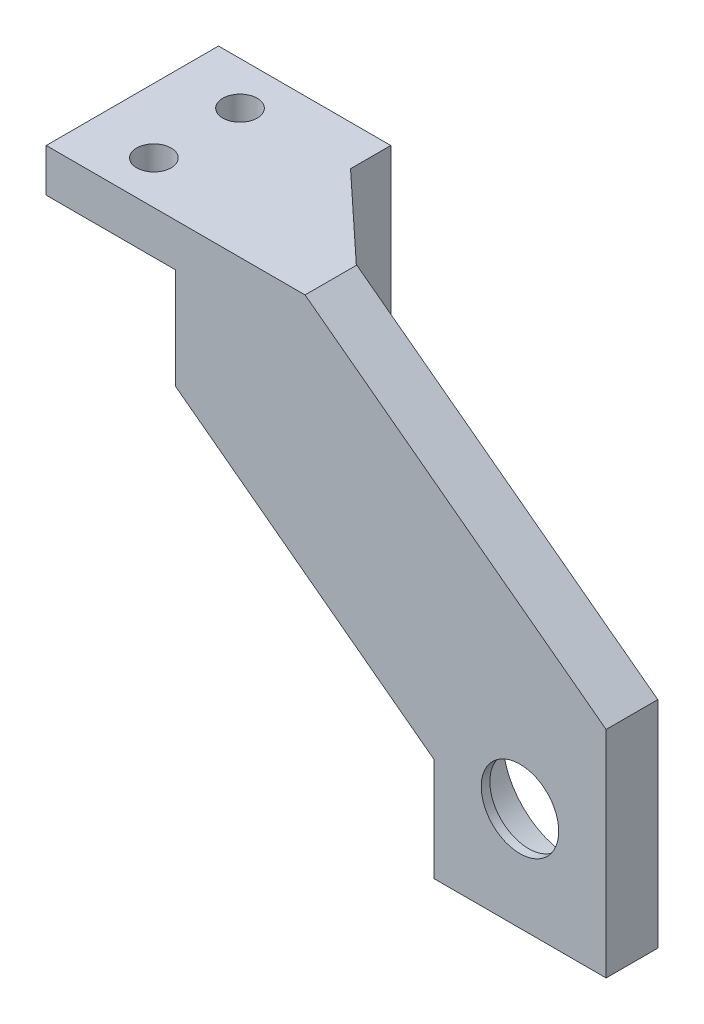
ISO-10303-21;
HEADER;
FILE_DESCRIPTION(('STEP AP214'),'2;1');
FILE_NAME('part.step','',(''),(''),'','','');
FILE_SCHEMA(('AUTOMOTIVE_DESIGN { 1 0 10303 214 1 1 1 1 }'));
ENDSEC;
DATA;
#1=APPLICATION_CONTEXT('core data for automotive mechanical design processes');
#2=APPLICATION_PROTOCOL_DEFINITION('international standard','automotive_design',2000,#1);
#3=PRODUCT_CONTEXT('',#1,'mechanical');
#4=PRODUCT('Part','Part','',(#3));
#5=PRODUCT_RELATED_PRODUCT_CATEGORY('part','',(#4));
#6=PRODUCT_DEFINITION_FORMATION('','',#4);
#7=PRODUCT_DEFINITION_CONTEXT('part definition',#1,'design');
#8=PRODUCT_DEFINITION('design','',#6,#7);
#9=PRODUCT_DEFINITION_SHAPE('','',#8);
#10=(LENGTH_UNIT() NAMED_UNIT(*) SI_UNIT(.MILLI.,.METRE.));
#11=(NAMED_UNIT(*) PLANE_ANGLE_UNIT() SI_UNIT($,.RADIAN.));
#12=(NAMED_UNIT(*) SI_UNIT($,.STERADIAN.) SOLID_ANGLE_UNIT());
#13=UNCERTAINTY_MEASURE_WITH_UNIT(LENGTH_MEASURE(1.E-05),#10,'distance_accuracy_value','');
#14=(GEOMETRIC_REPRESENTATION_CONTEXT(3) GLOBAL_UNCERTAINTY_ASSIGNED_CONTEXT((#13)) GLOBAL_UNIT_ASSIGNED_CONTEXT((#10,
#11,#12)) REPRESENTATION_CONTEXT('',''));
#15=CARTESIAN_POINT('',(0.,0.,0.));
#16=DIRECTION('',(0.,0.,1.));
#17=DIRECTION('',(1.,0.,0.));
#18=AXIS2_PLACEMENT_3D('',#15,#16,#17);
#19=CARTESIAN_POINT('',(0.,0.,-5.));
#20=DIRECTION('',(0.,0.,1.));
#21=DIRECTION('',(1.,0.,0.));
#22=AXIS2_PLACEMENT_3D('',#19,#20,#21);
#23=PLANE('',#22);
#24=CARTESIAN_POINT('',(0.,0.,-5.));
#25=DIRECTION('',(0.,0.,1.));
#26=DIRECTION('',(1.,0.,0.));
#27=AXIS2_PLACEMENT_3D('',#24,#25,#26);
#28=CIRCLE('',#27,8.);
#29=CARTESIAN_POINT('',(8.,0.,-5.00000000000001));
#30=VERTEX_POINT('',#29);
#31=EDGE_CURVE('E142',#30,#30,#28,.F.);
#32=ORIENTED_EDGE('',*,*,#31,.F.);
#33=EDGE_LOOP('',(#32));
#34=FACE_BOUND('',#33,.T.);
#35=DIRECTION('',(-1.,0.,0.));
#36=VECTOR('',#35,1.);
#37=CARTESIAN_POINT('',(0.,39.2000000000012,-5.));
#38=LINE('',#37,#36);
#39=CARTESIAN_POINT('',(-24.9487685866672,39.2000000000012,-5.));
#40=VERTEX_POINT('',#39);
#41=CARTESIAN_POINT('',(-25.0000000000002,39.2000000000012,-5.));
#42=VERTEX_POINT('',#41);
#43=EDGE_CURVE('E135',#40,#42,#38,.T.);
#44=ORIENTED_EDGE('',*,*,#43,.F.);
#45=DIRECTION('',(0.799999999999987,-0.600000000000018,0.));
#46=VECTOR('',#45,1.);
#47=CARTESIAN_POINT('',(9.83444330880013,13.1125910783996,-5.));
#48=LINE('',#47,#46);
#49=CARTESIAN_POINT('',(10.,12.9884235599996,-5.));
#50=VERTEX_POINT('',#49);
#51=EDGE_CURVE('E50',#40,#50,#48,.T.);
#52=ORIENTED_EDGE('',*,*,#51,.T.);
#53=DIRECTION('',(0.,-1.,0.));
#54=VECTOR('',#53,1.);
#55=CARTESIAN_POINT('',(10.,0.,-5.));
#56=LINE('',#55,#54);
#57=CARTESIAN_POINT('',(10.,-12.,-5.));
#58=VERTEX_POINT('',#57);
#59=EDGE_CURVE('E133',#50,#58,#56,.T.);
#60=ORIENTED_EDGE('',*,*,#59,.T.);
#61=DIRECTION('',(-1.,0.,0.));
#62=VECTOR('',#61,1.);
#63=CARTESIAN_POINT('',(0.,-12.,-5.));
#64=LINE('',#63,#62);
#65=CARTESIAN_POINT('',(-9.99999999999998,-12.,-5.));
#66=VERTEX_POINT('',#65);
#67=EDGE_CURVE('E258',#58,#66,#64,.T.);
#68=ORIENTED_EDGE('',*,*,#67,.T.);
#69=DIRECTION('',(0.,1.,0.));
#70=VECTOR('',#69,1.);
#71=CARTESIAN_POINT('',(-9.99999999999999,0.,-5.));
#72=LINE('',#71,#70);
#73=CARTESIAN_POINT('',(-10.,0.,-5.));
#74=VERTEX_POINT('',#73);
#75=EDGE_CURVE('E156',#66,#74,#72,.T.);
#76=ORIENTED_EDGE('',*,*,#75,.T.);
#77=DIRECTION('',(-0.799999999999987,0.600000000000018,0.));
#78=VECTOR('',#77,1.);
#79=CARTESIAN_POINT('',(-3.60000000000021,-4.80000000000006,-5.));
#80=LINE('',#79,#78);
#81=CARTESIAN_POINT('',(-25.0000000000002,11.2500000000007,-5.));
#82=VERTEX_POINT('',#81);
#83=EDGE_CURVE('E143',#74,#82,#80,.T.);
#84=ORIENTED_EDGE('',*,*,#83,.T.);
#85=DIRECTION('',(0.,-1.,0.));
#86=VECTOR('',#85,1.);
#87=CARTESIAN_POINT('',(-25.0000000000002,107.207352543679,-4.99999999999999));
#88=LINE('',#87,#86);
#89=EDGE_CURVE('E57',#42,#82,#88,.T.);
#90=ORIENTED_EDGE('',*,*,#89,.F.);
#91=EDGE_LOOP('',(#44,#52,#60,#68,#76,#84,#90));
#92=FACE_BOUND('',#91,.T.);
#93=ADVANCED_FACE('F35',(#34,#92),#23,.F.);
#94=CARTESIAN_POINT('',(0.,34.2000000000012,0.));
#95=DIRECTION('',(0.,1.,0.));
#96=DIRECTION('',(0.,0.,1.));
#97=AXIS2_PLACEMENT_3D('',#94,#95,#96);
#98=PLANE('',#97);
#99=CARTESIAN_POINT('',(-47.5000000000003,34.2000000000012,-14.));
#100=DIRECTION('',(0.,1.,0.));
#101=DIRECTION('',(0.,0.,1.));
#102=AXIS2_PLACEMENT_3D('',#99,#100,#101);
#103=CIRCLE('',#102,2.);
#104=CARTESIAN_POINT('',(-47.5000000000003,34.2000000000012,-12.));
#105=VERTEX_POINT('',#104);
#106=EDGE_CURVE('E281',#105,#105,#103,.T.);
#107=ORIENTED_EDGE('',*,*,#106,.T.);
#108=EDGE_LOOP('',(#107));
#109=FACE_BOUND('',#108,.T.);
#110=CARTESIAN_POINT('',(-47.5000000000003,34.2000000000012,-3.99999999999999));
#111=DIRECTION('',(0.,1.,0.));
#112=DIRECTION('',(0.,0.,1.));
#113=AXIS2_PLACEMENT_3D('',#110,#111,#112);
#114=CIRCLE('',#113,2.);
#115=CARTESIAN_POINT('',(-47.5000000000003,34.2000000000012,-1.99999999999999));
#116=VERTEX_POINT('',#115);
#117=EDGE_CURVE('E284',#116,#116,#114,.T.);
#118=ORIENTED_EDGE('',*,*,#117,.T.);
#119=EDGE_LOOP('',(#118));
#120=FACE_BOUND('',#119,.T.);
#121=DIRECTION('',(1.,0.,0.));
#122=VECTOR('',#121,1.);
#123=CARTESIAN_POINT('',(0.,34.2000000000012,-19.));
#124=LINE('',#123,#122);
#125=CARTESIAN_POINT('',(-55.0000000000003,34.2000000000012,-19.));
#126=VERTEX_POINT('',#125);
#127=CARTESIAN_POINT('',(-40.0000000000003,34.2000000000012,-19.));
#128=VERTEX_POINT('',#127);
#129=EDGE_CURVE('E236',#126,#128,#124,.T.);
#130=ORIENTED_EDGE('',*,*,#129,.T.);
#131=DIRECTION('',(0.,0.,1.));
#132=VECTOR('',#131,1.);
#133=CARTESIAN_POINT('',(-40.0000000000003,34.2000000000012,-65.5775535986731));
#134=LINE('',#133,#132);
#135=CARTESIAN_POINT('',(-40.0000000000003,34.2000000000012,1.00000000000001));
#136=VERTEX_POINT('',#135);
#137=EDGE_CURVE('E161',#128,#136,#134,.T.);
#138=ORIENTED_EDGE('',*,*,#137,.T.);
#139=DIRECTION('',(-1.,0.,0.));
#140=VECTOR('',#139,1.);
#141=CARTESIAN_POINT('',(0.,34.2000000000012,1.));
#142=LINE('',#141,#140);
#143=CARTESIAN_POINT('',(-55.0000000000003,34.2000000000012,1.));
#144=VERTEX_POINT('',#143);
#145=EDGE_CURVE('E242',#136,#144,#142,.T.);
#146=ORIENTED_EDGE('',*,*,#145,.T.);
#147=DIRECTION('',(0.,0.,-1.));
#148=VECTOR('',#147,1.);
#149=CARTESIAN_POINT('',(-55.0000000000003,34.2000000000012,0.));
#150=LINE('',#149,#148);
#151=EDGE_CURVE('E239',#144,#126,#150,.T.);
#152=ORIENTED_EDGE('',*,*,#151,.T.);
#153=EDGE_LOOP('',(#130,#138,#146,#152));
#154=FACE_BOUND('',#153,.T.);
#155=ADVANCED_FACE('F179',(#109,#120,#154),#98,.F.);
#156=CARTESIAN_POINT('',(0.,0.,0.));
#157=DIRECTION('',(0.,0.,1.));
#158=DIRECTION('',(1.,0.,0.));
#159=AXIS2_PLACEMENT_3D('',#156,#157,#158);
#160=PLANE('',#159);
#161=CARTESIAN_POINT('',(0.,0.,0.));
#162=DIRECTION('',(0.,0.,1.));
#163=DIRECTION('',(1.,0.,0.));
#164=AXIS2_PLACEMENT_3D('',#161,#162,#163);
#165=CIRCLE('',#164,4.5);
#166=CARTESIAN_POINT('',(4.5,0.,0.));
#167=VERTEX_POINT('',#166);
#168=EDGE_CURVE('E146',#167,#167,#165,.T.);
#169=ORIENTED_EDGE('',*,*,#168,.T.);
#170=EDGE_LOOP('',(#169));
#171=FACE_BOUND('',#170,.T.);
#172=CARTESIAN_POINT('',(0.,0.,0.));
#173=DIRECTION('',(0.,0.,1.));
#174=DIRECTION('',(1.,0.,0.));
#175=AXIS2_PLACEMENT_3D('',#172,#173,#174);
#176=CIRCLE('',#175,8.);
#177=CARTESIAN_POINT('',(8.,0.,0.));
#178=VERTEX_POINT('',#177);
#179=EDGE_CURVE('E43',#178,#178,#176,.T.);
#180=ORIENTED_EDGE('',*,*,#179,.F.);
#181=EDGE_LOOP('',(#180));
#182=FACE_BOUND('',#181,.T.);
#183=ADVANCED_FACE('F177',(#171,#182),#160,.F.);
#184=CARTESIAN_POINT('',(0.,0.,1.));
#185=DIRECTION('',(0.,0.,-1.));
#186=DIRECTION('',(-1.,0.,0.));
#187=AXIS2_PLACEMENT_3D('',#184,#185,#186);
#188=CYLINDRICAL_SURFACE('',#187,4.5);
#189=CARTESIAN_POINT('',(0.,0.,1.));
#190=DIRECTION('',(0.,0.,1.));
#191=DIRECTION('',(1.,0.,0.));
#192=AXIS2_PLACEMENT_3D('',#189,#190,#191);
#193=CIRCLE('',#192,4.5);
#194=CARTESIAN_POINT('',(4.5,0.,1.));
#195=VERTEX_POINT('',#194);
#196=EDGE_CURVE('E168',#195,#195,#193,.T.);
#197=ORIENTED_EDGE('',*,*,#196,.T.);
#198=EDGE_LOOP('',(#197));
#199=FACE_BOUND('',#198,.T.);
#200=ORIENTED_EDGE('',*,*,#168,.F.);
#201=EDGE_LOOP('',(#200));
#202=FACE_BOUND('',#201,.T.);
#203=ADVANCED_FACE('F37',(#199,#202),#188,.F.);
#204=CARTESIAN_POINT('',(0.,0.,1.));
#205=DIRECTION('',(0.,0.,1.));
#206=DIRECTION('',(1.,0.,0.));
#207=AXIS2_PLACEMENT_3D('',#204,#205,#206);
#208=PLANE('',#207);
#209=DIRECTION('',(0.799999999999987,-0.600000000000018,0.));
#210=VECTOR('',#209,1.);
#211=CARTESIAN_POINT('',(9.83444330880013,13.1125910783996,1.));
#212=LINE('',#211,#210);
#213=CARTESIAN_POINT('',(-24.9487685866672,39.2000000000012,1.));
#214=VERTEX_POINT('',#213);
#215=CARTESIAN_POINT('',(10.,12.9884235599996,1.00000000000001));
#216=VERTEX_POINT('',#215);
#217=EDGE_CURVE('E126',#214,#216,#212,.T.);
#218=ORIENTED_EDGE('',*,*,#217,.F.);
#219=DIRECTION('',(1.,0.,0.));
#220=VECTOR('',#219,1.);
#221=CARTESIAN_POINT('',(0.,39.2000000000012,1.));
#222=LINE('',#221,#220);
#223=CARTESIAN_POINT('',(-55.0000000000003,39.2000000000012,1.00000000000001));
#224=VERTEX_POINT('',#223);
#225=EDGE_CURVE('E213',#224,#214,#222,.T.);
#226=ORIENTED_EDGE('',*,*,#225,.F.);
#227=DIRECTION('',(0.,-1.,0.));
#228=VECTOR('',#227,1.);
#229=CARTESIAN_POINT('',(-55.0000000000003,107.207352543679,1.00000000000001));
#230=LINE('',#229,#228);
#231=EDGE_CURVE('E245',#224,#144,#230,.T.);
#232=ORIENTED_EDGE('',*,*,#231,.T.);
#233=ORIENTED_EDGE('',*,*,#145,.F.);
#234=DIRECTION('',(0.,-1.,0.));
#235=VECTOR('',#234,1.);
#236=CARTESIAN_POINT('',(-40.0000000000002,0.,1.));
#237=LINE('',#236,#235);
#238=CARTESIAN_POINT('',(-40.0000000000002,22.5000000000012,1.));
#239=VERTEX_POINT('',#238);
#240=EDGE_CURVE('E152',#136,#239,#237,.T.);
#241=ORIENTED_EDGE('',*,*,#240,.T.);
#242=DIRECTION('',(0.799999999999987,-0.600000000000018,0.));
#243=VECTOR('',#242,1.);
#244=CARTESIAN_POINT('',(-3.60000000000021,-4.80000000000006,1.));
#245=LINE('',#244,#243);
#246=CARTESIAN_POINT('',(-9.99999999999999,0.,1.));
#247=VERTEX_POINT('',#246);
#248=EDGE_CURVE('E155',#239,#247,#245,.T.);
#249=ORIENTED_EDGE('',*,*,#248,.T.);
#250=DIRECTION('',(0.,-1.,0.));
#251=VECTOR('',#250,1.);
#252=CARTESIAN_POINT('',(-9.99999999999999,0.,1.));
#253=LINE('',#252,#251);
#254=CARTESIAN_POINT('',(-9.99999999999998,-12.,1.));
#255=VERTEX_POINT('',#254);
#256=EDGE_CURVE('E255',#247,#255,#253,.T.);
#257=ORIENTED_EDGE('',*,*,#256,.T.);
#258=DIRECTION('',(1.,0.,0.));
#259=VECTOR('',#258,1.);
#260=CARTESIAN_POINT('',(0.,-12.,1.));
#261=LINE('',#260,#259);
#262=CARTESIAN_POINT('',(10.,-12.,1.));
#263=VERTEX_POINT('',#262);
#264=EDGE_CURVE('E254',#255,#263,#261,.T.);
#265=ORIENTED_EDGE('',*,*,#264,.T.);
#266=DIRECTION('',(0.,1.,0.));
#267=VECTOR('',#266,1.);
#268=CARTESIAN_POINT('',(10.,0.,1.));
#269=LINE('',#268,#267);
#270=EDGE_CURVE('E159',#263,#216,#269,.T.);
#271=ORIENTED_EDGE('',*,*,#270,.T.);
#272=EDGE_LOOP('',(#218,#226,#232,#233,#241,#249,#257,#265,#271));
#273=FACE_BOUND('',#272,.T.);
#274=ORIENTED_EDGE('',*,*,#196,.F.);
#275=EDGE_LOOP('',(#274));
#276=FACE_BOUND('',#275,.T.);
#277=ADVANCED_FACE('F185',(#273,#276),#208,.T.);
#278=CARTESIAN_POINT('',(0.,0.,-33.2842712474619));
#279=DIRECTION('',(0.,0.,1.));
#280=DIRECTION('',(1.,0.,0.));
#281=AXIS2_PLACEMENT_3D('',#278,#279,#280);
#282=CYLINDRICAL_SURFACE('',#281,8.);
#283=CARTESIAN_POINT('',(8.,0.,-5.00000000000001));
#284=CARTESIAN_POINT('',(8.,0.,-4.94791666666667));
#285=CARTESIAN_POINT('',(8.,0.,-4.89583333333334));
#286=CARTESIAN_POINT('',(8.,0.,-4.79166666666667));
#287=CARTESIAN_POINT('',(8.,0.,-4.73958333333334));
#288=CARTESIAN_POINT('',(8.,0.,-4.63541666666667));
#289=CARTESIAN_POINT('',(8.,0.,-4.58333333333334));
#290=CARTESIAN_POINT('',(8.,0.,-4.47916666666667));
#291=CARTESIAN_POINT('',(8.,0.,-4.42708333333334));
#292=CARTESIAN_POINT('',(8.,0.,-4.32291666666667));
#293=CARTESIAN_POINT('',(8.,0.,-4.27083333333334));
#294=CARTESIAN_POINT('',(8.,0.,-4.16666666666667));
#295=CARTESIAN_POINT('',(8.,0.,-4.11458333333334));
#296=CARTESIAN_POINT('',(8.,0.,-4.01041666666667));
#297=CARTESIAN_POINT('',(8.,0.,-3.95833333333334));
#298=CARTESIAN_POINT('',(8.,0.,-3.85416666666667));
#299=CARTESIAN_POINT('',(8.,0.,-3.80208333333334));
#300=CARTESIAN_POINT('',(8.,0.,-3.69791666666667));
#301=CARTESIAN_POINT('',(8.,0.,-3.64583333333334));
#302=CARTESIAN_POINT('',(8.,0.,-3.54166666666667));
#303=CARTESIAN_POINT('',(8.,0.,-3.48958333333334));
#304=CARTESIAN_POINT('',(8.,0.,-3.38541666666667));
#305=CARTESIAN_POINT('',(8.,0.,-3.33333333333334));
#306=CARTESIAN_POINT('',(8.,0.,-3.22916666666667));
#307=CARTESIAN_POINT('',(8.,0.,-3.17708333333334));
#308=CARTESIAN_POINT('',(8.,0.,-3.07291666666667));
#309=CARTESIAN_POINT('',(8.,0.,-3.02083333333334));
#310=CARTESIAN_POINT('',(8.,0.,-2.91666666666667));
#311=CARTESIAN_POINT('',(8.,0.,-2.86458333333334));
#312=CARTESIAN_POINT('',(8.,0.,-2.76041666666667));
#313=CARTESIAN_POINT('',(8.,0.,-2.70833333333334));
#314=CARTESIAN_POINT('',(8.,0.,-2.60416666666667));
#315=CARTESIAN_POINT('',(8.,0.,-2.55208333333334));
#316=CARTESIAN_POINT('',(8.,0.,-2.44791666666667));
#317=CARTESIAN_POINT('',(8.,0.,-2.39583333333334));
#318=CARTESIAN_POINT('',(8.,0.,-2.29166666666667));
#319=CARTESIAN_POINT('',(8.,0.,-2.23958333333334));
#320=CARTESIAN_POINT('',(8.,0.,-2.13541666666667));
#321=CARTESIAN_POINT('',(8.,0.,-2.08333333333334));
#322=CARTESIAN_POINT('',(8.,0.,-1.97916666666667));
#323=CARTESIAN_POINT('',(8.,0.,-1.92708333333334));
#324=CARTESIAN_POINT('',(8.,0.,-1.82291666666668));
#325=CARTESIAN_POINT('',(8.,0.,-1.77083333333334));
#326=CARTESIAN_POINT('',(8.,0.,-1.66666666666668));
#327=CARTESIAN_POINT('',(8.,0.,-1.61458333333334));
#328=CARTESIAN_POINT('',(8.,0.,-1.51041666666667));
#329=CARTESIAN_POINT('',(8.,0.,-1.45833333333334));
#330=CARTESIAN_POINT('',(8.,0.,-1.35416666666667));
#331=CARTESIAN_POINT('',(8.,0.,-1.30208333333334));
#332=CARTESIAN_POINT('',(8.,0.,-1.19791666666668));
#333=CARTESIAN_POINT('',(8.,0.,-1.14583333333334));
#334=CARTESIAN_POINT('',(8.,0.,-1.04166666666668));
#335=CARTESIAN_POINT('',(8.,0.,-0.989583333333342));
#336=CARTESIAN_POINT('',(8.,0.,-0.885416666666673));
#337=CARTESIAN_POINT('',(8.,0.,-0.833333333333339));
#338=CARTESIAN_POINT('',(8.,0.,-0.729166666666672));
#339=CARTESIAN_POINT('',(8.,0.,-0.67708333333334));
#340=CARTESIAN_POINT('',(8.,0.,-0.572916666666675));
#341=CARTESIAN_POINT('',(8.,0.,-0.520833333333343));
#342=CARTESIAN_POINT('',(8.,0.,-0.416666666666676));
#343=CARTESIAN_POINT('',(8.,0.,-0.364583333333342));
#344=CARTESIAN_POINT('',(8.,0.,-0.260416666666673));
#345=CARTESIAN_POINT('',(8.,0.,-0.208333333333338));
#346=CARTESIAN_POINT('',(8.,0.,-0.104166666666671));
#347=CARTESIAN_POINT('',(8.,0.,-0.0520833333333391));
#348=CARTESIAN_POINT('',(8.,0.,0.));
#349=B_SPLINE_CURVE_WITH_KNOTS('',3,(#283,#284,#285,#286,#287,#288,#289,#290,#291,#292,#293,
#294,#295,#296,#297,#298,#299,#300,#301,#302,#303,#304,#305,#306,#307,#308,#309,#310,#311,#312,
#313,#314,#315,#316,#317,#318,#319,#320,#321,#322,#323,#324,#325,#326,#327,#328,#329,#330,#331,
#332,#333,#334,#335,#336,#337,#338,#339,#340,#341,#342,#343,#344,#345,#346,#347,#348),
.UNSPECIFIED.,.F.,.F.,(4,2,2,2,2,2,2,2,2,2,2,2,2,2,2,2,2,2,2,2,2,2,2,2,2,2,2,2,2,2,2,2,4),(0.,
0.15625,0.3125,0.46875,0.625000000000001,0.781250000000001,0.937500000000001,1.09375,1.25,
1.40625,1.5625,1.71875,1.875,2.03125,2.1875,2.34375,2.5,2.65625,2.8125,2.96875,3.125,3.28125,
3.4375,3.59375,3.75,3.90625,4.0625,4.21875,4.375,4.53125,4.6875,4.84375,5.),.UNSPECIFIED.);
#350=EDGE_CURVE('BSEAM175',#30,#178,#349,.T.);
#351=ORIENTED_EDGE('',*,*,#31,.T.);
#352=ORIENTED_EDGE('',*,*,#179,.T.);
#353=ORIENTED_EDGE('',*,*,#350,.T.);
#354=ORIENTED_EDGE('',*,*,#350,.F.);
#355=EDGE_LOOP('',(#351,#353,#352,#354));
#356=FACE_BOUND('',#355,.T.);
#357=ADVANCED_FACE('F175',(#356),#282,.F.);
#358=CARTESIAN_POINT('',(10.,0.,-65.5775535986731));
#359=DIRECTION('',(1.,0.,0.));
#360=DIRECTION('',(0.,1.,0.));
#361=AXIS2_PLACEMENT_3D('',#358,#359,#360);
#362=PLANE('',#361);
#363=DIRECTION('',(0.,0.,1.));
#364=VECTOR('',#363,1.);
#365=CARTESIAN_POINT('',(10.,12.9884235599996,-19.));
#366=LINE('',#365,#364);
#367=EDGE_CURVE('E123',#50,#216,#366,.T.);
#368=ORIENTED_EDGE('',*,*,#367,.T.);
#369=ORIENTED_EDGE('',*,*,#270,.F.);
#370=DIRECTION('',(0.,0.,1.));
#371=VECTOR('',#370,1.);
#372=CARTESIAN_POINT('',(10.,-12.,-65.5775535986731));
#373=LINE('',#372,#371);
#374=EDGE_CURVE('E141',#58,#263,#373,.T.);
#375=ORIENTED_EDGE('',*,*,#374,.F.);
#376=ORIENTED_EDGE('',*,*,#59,.F.);
#377=EDGE_LOOP('',(#368,#369,#375,#376));
#378=FACE_BOUND('',#377,.T.);
#379=ADVANCED_FACE('F139',(#378),#362,.T.);
#380=CARTESIAN_POINT('',(-3.60000000000021,-4.80000000000006,-65.5775535986731));
#381=DIRECTION('',(-0.600000000000018,-0.799999999999987,0.));
#382=DIRECTION('',(0.799999999999987,-0.600000000000018,0.));
#383=AXIS2_PLACEMENT_3D('',#380,#381,#382);
#384=PLANE('',#383);
#385=ORIENTED_EDGE('',*,*,#83,.F.);
#386=DIRECTION('',(0.,0.,1.));
#387=VECTOR('',#386,1.);
#388=CARTESIAN_POINT('',(-9.99999999999999,0.,-65.5775535986731));
#389=LINE('',#388,#387);
#390=EDGE_CURVE('E148',#74,#247,#389,.T.);
#391=ORIENTED_EDGE('',*,*,#390,.T.);
#392=ORIENTED_EDGE('',*,*,#248,.F.);
#393=DIRECTION('',(0.,0.,1.));
#394=VECTOR('',#393,1.);
#395=CARTESIAN_POINT('',(-40.0000000000002,22.5000000000012,-65.5775535986731));
#396=LINE('',#395,#394);
#397=CARTESIAN_POINT('',(-40.0000000000003,22.5000000000012,-19.));
#398=VERTEX_POINT('',#397);
#399=EDGE_CURVE('E164',#398,#239,#396,.T.);
#400=ORIENTED_EDGE('',*,*,#399,.F.);
#401=DIRECTION('',(0.799999999999987,-0.600000000000018,0.));
#402=VECTOR('',#401,1.);
#403=CARTESIAN_POINT('',(-0.620126354511602,-7.03490523411663,-19.));
#404=LINE('',#403,#402);
#405=CARTESIAN_POINT('',(-35.0000000000003,18.7500000000011,-19.));
#406=VERTEX_POINT('',#405);
#407=EDGE_CURVE('E277',#398,#406,#404,.T.);
#408=ORIENTED_EDGE('',*,*,#407,.T.);
#409=DIRECTION('',(0.,0.,1.));
#410=VECTOR('',#409,1.);
#411=CARTESIAN_POINT('',(-35.0000000000003,18.7500000000011,0.));
#412=LINE('',#411,#410);
#413=CARTESIAN_POINT('',(-35.0000000000003,18.7500000000011,-14.33));
#414=VERTEX_POINT('',#413);
#415=EDGE_CURVE('E274',#406,#414,#412,.T.);
#416=ORIENTED_EDGE('',*,*,#415,.T.);
#417=DIRECTION('',(0.641106126814885,-0.480829595111186,0.598152016318285));
#418=VECTOR('',#417,1.);
#419=CARTESIAN_POINT('',(-7.4255051826885,-1.93087111298372,11.3970036645518));
#420=LINE('',#419,#418);
#421=EDGE_CURVE('E271',#414,#82,#420,.T.);
#422=ORIENTED_EDGE('',*,*,#421,.T.);
#423=EDGE_LOOP('',(#385,#391,#392,#400,#408,#416,#422));
#424=FACE_BOUND('',#423,.T.);
#425=ADVANCED_FACE('F269',(#424),#384,.T.);
#426=CARTESIAN_POINT('',(-40.0000000000002,0.,-65.5775535986731));
#427=DIRECTION('',(-1.,0.,0.));
#428=DIRECTION('',(0.,-1.,0.));
#429=AXIS2_PLACEMENT_3D('',#426,#427,#428);
#430=PLANE('',#429);
#431=ORIENTED_EDGE('',*,*,#137,.F.);
#432=DIRECTION('',(0.,1.,0.));
#433=VECTOR('',#432,1.);
#434=CARTESIAN_POINT('',(-40.0000000000003,-6.20807009476784,-19.));
#435=LINE('',#434,#433);
#436=EDGE_CURVE('E228',#398,#128,#435,.T.);
#437=ORIENTED_EDGE('',*,*,#436,.F.);
#438=ORIENTED_EDGE('',*,*,#399,.T.);
#439=ORIENTED_EDGE('',*,*,#240,.F.);
#440=EDGE_LOOP('',(#431,#437,#438,#439));
#441=FACE_BOUND('',#440,.T.);
#442=ADVANCED_FACE('F319',(#441),#430,.T.);
#443=CARTESIAN_POINT('',(0.,-12.,-65.5775535986731));
#444=DIRECTION('',(0.,-1.,0.));
#445=DIRECTION('',(0.,0.,-1.));
#446=AXIS2_PLACEMENT_3D('',#443,#444,#445);
#447=PLANE('',#446);
#448=ORIENTED_EDGE('',*,*,#67,.F.);
#449=ORIENTED_EDGE('',*,*,#374,.T.);
#450=ORIENTED_EDGE('',*,*,#264,.F.);
#451=DIRECTION('',(0.,0.,1.));
#452=VECTOR('',#451,1.);
#453=CARTESIAN_POINT('',(-9.99999999999998,-12.,-65.5775535986731));
#454=LINE('',#453,#452);
#455=EDGE_CURVE('E252',#66,#255,#454,.T.);
#456=ORIENTED_EDGE('',*,*,#455,.F.);
#457=EDGE_LOOP('',(#448,#449,#450,#456));
#458=FACE_BOUND('',#457,.T.);
#459=ADVANCED_FACE('F333',(#458),#447,.T.);
#460=CARTESIAN_POINT('',(-9.99999999999999,0.,-65.5775535986731));
#461=DIRECTION('',(-1.,0.,0.));
#462=DIRECTION('',(0.,-1.,0.));
#463=AXIS2_PLACEMENT_3D('',#460,#461,#462);
#464=PLANE('',#463);
#465=ORIENTED_EDGE('',*,*,#75,.F.);
#466=ORIENTED_EDGE('',*,*,#455,.T.);
#467=ORIENTED_EDGE('',*,*,#256,.F.);
#468=ORIENTED_EDGE('',*,*,#390,.F.);
#469=EDGE_LOOP('',(#465,#466,#467,#468));
#470=FACE_BOUND('',#469,.T.);
#471=ADVANCED_FACE('F266',(#470),#464,.T.);
#472=CARTESIAN_POINT('',(-9.14051085037126,107.207352543679,9.79690337660378));
#473=DIRECTION('',(0.682187982374244,0.,-0.731176829983116));
#474=DIRECTION('',(-0.731176829983116,0.,-0.682187982374244));
#475=AXIS2_PLACEMENT_3D('',#472,#473,#474);
#476=PLANE('',#475);
#477=DIRECTION('',(-0.731176829983116,0.,-0.682187982374244));
#478=VECTOR('',#477,1.);
#479=CARTESIAN_POINT('',(-9.14051085037126,39.2000000000012,9.79690337660378));
#480=LINE('',#479,#478);
#481=CARTESIAN_POINT('',(-35.0000000000003,39.2000000000012,-14.33));
#482=VERTEX_POINT('',#481);
#483=EDGE_CURVE('E234',#42,#482,#480,.T.);
#484=ORIENTED_EDGE('',*,*,#483,.F.);
#485=ORIENTED_EDGE('',*,*,#89,.T.);
#486=ORIENTED_EDGE('',*,*,#421,.F.);
#487=DIRECTION('',(0.,-1.,0.));
#488=VECTOR('',#487,1.);
#489=CARTESIAN_POINT('',(-35.0000000000003,107.207352543679,-14.33));
#490=LINE('',#489,#488);
#491=EDGE_CURVE('E221',#482,#414,#490,.T.);
#492=ORIENTED_EDGE('',*,*,#491,.F.);
#493=EDGE_LOOP('',(#484,#485,#486,#492));
#494=FACE_BOUND('',#493,.T.);
#495=ADVANCED_FACE('F325',(#494),#476,.T.);
#496=CARTESIAN_POINT('',(-35.0000000000003,107.207352543679,0.));
#497=DIRECTION('',(1.,0.,0.));
#498=DIRECTION('',(0.,1.,0.));
#499=AXIS2_PLACEMENT_3D('',#496,#497,#498);
#500=PLANE('',#499);
#501=DIRECTION('',(0.,0.,-1.));
#502=VECTOR('',#501,1.);
#503=CARTESIAN_POINT('',(-35.0000000000003,39.2000000000012,0.));
#504=LINE('',#503,#502);
#505=CARTESIAN_POINT('',(-35.0000000000003,39.2000000000012,-19.));
#506=VERTEX_POINT('',#505);
#507=EDGE_CURVE('E232',#482,#506,#504,.T.);
#508=ORIENTED_EDGE('',*,*,#507,.F.);
#509=ORIENTED_EDGE('',*,*,#491,.T.);
#510=ORIENTED_EDGE('',*,*,#415,.F.);
#511=DIRECTION('',(0.,-1.,0.));
#512=VECTOR('',#511,1.);
#513=CARTESIAN_POINT('',(-35.0000000000003,107.207352543679,-19.));
#514=LINE('',#513,#512);
#515=EDGE_CURVE('E225',#506,#406,#514,.T.);
#516=ORIENTED_EDGE('',*,*,#515,.F.);
#517=EDGE_LOOP('',(#508,#509,#510,#516));
#518=FACE_BOUND('',#517,.T.);
#519=ADVANCED_FACE('F324',(#518),#500,.T.);
#520=CARTESIAN_POINT('',(0.,107.207352543679,-19.));
#521=DIRECTION('',(0.,0.,-1.));
#522=DIRECTION('',(-1.,0.,0.));
#523=AXIS2_PLACEMENT_3D('',#520,#521,#522);
#524=PLANE('',#523);
#525=DIRECTION('',(-1.,0.,0.));
#526=VECTOR('',#525,1.);
#527=CARTESIAN_POINT('',(0.,39.2000000000012,-19.));
#528=LINE('',#527,#526);
#529=CARTESIAN_POINT('',(-55.0000000000003,39.2000000000012,-19.));
#530=VERTEX_POINT('',#529);
#531=EDGE_CURVE('E223',#506,#530,#528,.T.);
#532=ORIENTED_EDGE('',*,*,#531,.F.);
#533=ORIENTED_EDGE('',*,*,#515,.T.);
#534=ORIENTED_EDGE('',*,*,#407,.F.);
#535=ORIENTED_EDGE('',*,*,#436,.T.);
#536=ORIENTED_EDGE('',*,*,#129,.F.);
#537=DIRECTION('',(0.,-1.,0.));
#538=VECTOR('',#537,1.);
#539=CARTESIAN_POINT('',(-55.0000000000003,107.207352543679,-19.));
#540=LINE('',#539,#538);
#541=EDGE_CURVE('E247',#530,#126,#540,.T.);
#542=ORIENTED_EDGE('',*,*,#541,.F.);
#543=EDGE_LOOP('',(#532,#533,#534,#535,#536,#542));
#544=FACE_BOUND('',#543,.T.);
#545=ADVANCED_FACE('F317',(#544),#524,.T.);
#546=CARTESIAN_POINT('',(-55.0000000000003,107.207352543679,0.));
#547=DIRECTION('',(-1.,0.,0.));
#548=DIRECTION('',(0.,-1.,0.));
#549=AXIS2_PLACEMENT_3D('',#546,#547,#548);
#550=PLANE('',#549);
#551=DIRECTION('',(0.,0.,1.));
#552=VECTOR('',#551,1.);
#553=CARTESIAN_POINT('',(-55.0000000000003,39.2000000000012,0.));
#554=LINE('',#553,#552);
#555=EDGE_CURVE('E220',#530,#224,#554,.T.);
#556=ORIENTED_EDGE('',*,*,#555,.F.);
#557=ORIENTED_EDGE('',*,*,#541,.T.);
#558=ORIENTED_EDGE('',*,*,#151,.F.);
#559=ORIENTED_EDGE('',*,*,#231,.F.);
#560=EDGE_LOOP('',(#556,#557,#558,#559));
#561=FACE_BOUND('',#560,.T.);
#562=ADVANCED_FACE('F299',(#561),#550,.T.);
#563=CARTESIAN_POINT('',(0.,39.2000000000012,-174.094532476243));
#564=DIRECTION('',(0.,-1.,0.));
#565=DIRECTION('',(0.,0.,1.));
#566=AXIS2_PLACEMENT_3D('',#563,#564,#565);
#567=PLANE('',#566);
#568=CARTESIAN_POINT('',(-47.5000000000003,39.2000000000012,-14.));
#569=DIRECTION('',(0.,1.,0.));
#570=DIRECTION('',(0.,0.,1.));
#571=AXIS2_PLACEMENT_3D('',#568,#569,#570);
#572=CIRCLE('',#571,2.);
#573=CARTESIAN_POINT('',(-47.5000000000003,39.2000000000012,-12.));
#574=VERTEX_POINT('',#573);
#575=EDGE_CURVE('E287',#574,#574,#572,.T.);
#576=ORIENTED_EDGE('',*,*,#575,.F.);
#577=EDGE_LOOP('',(#576));
#578=FACE_BOUND('',#577,.T.);
#579=CARTESIAN_POINT('',(-47.5000000000003,39.2000000000012,-3.99999999999999));
#580=DIRECTION('',(0.,1.,0.));
#581=DIRECTION('',(0.,0.,-1.));
#582=AXIS2_PLACEMENT_3D('',#579,#580,#581);
#583=CIRCLE('',#582,2.);
#584=CARTESIAN_POINT('',(-47.5000000000003,39.2000000000012,-5.99999999999999));
#585=VERTEX_POINT('',#584);
#586=EDGE_CURVE('E136',#585,#585,#583,.T.);
#587=ORIENTED_EDGE('',*,*,#586,.F.);
#588=EDGE_LOOP('',(#587));
#589=FACE_BOUND('',#588,.T.);
#590=ORIENTED_EDGE('',*,*,#225,.T.);
#591=DIRECTION('',(0.,0.,-1.));
#592=VECTOR('',#591,1.);
#593=CARTESIAN_POINT('',(-24.9487685866672,39.2000000000012,-174.094532476243));
#594=LINE('',#593,#592);
#595=EDGE_CURVE('E11',#214,#40,#594,.T.);
#596=ORIENTED_EDGE('',*,*,#595,.T.);
#597=ORIENTED_EDGE('',*,*,#43,.T.);
#598=ORIENTED_EDGE('',*,*,#483,.T.);
#599=ORIENTED_EDGE('',*,*,#507,.T.);
#600=ORIENTED_EDGE('',*,*,#531,.T.);
#601=ORIENTED_EDGE('',*,*,#555,.T.);
#602=EDGE_LOOP('',(#590,#596,#597,#598,#599,#600,#601));
#603=FACE_BOUND('',#602,.T.);
#604=ADVANCED_FACE('F218',(#578,#589,#603),#567,.F.);
#605=CARTESIAN_POINT('',(-47.5000000000003,-12.,-3.99999999999999));
#606=DIRECTION('',(0.,1.,0.));
#607=DIRECTION('',(0.,0.,1.));
#608=AXIS2_PLACEMENT_3D('',#605,#606,#607);
#609=CYLINDRICAL_SURFACE('',#608,2.);
#610=ORIENTED_EDGE('',*,*,#586,.T.);
#611=EDGE_LOOP('',(#610));
#612=FACE_BOUND('',#611,.T.);
#613=ORIENTED_EDGE('',*,*,#117,.F.);
#614=EDGE_LOOP('',(#613));
#615=FACE_BOUND('',#614,.T.);
#616=ADVANCED_FACE('F298',(#612,#615),#609,.F.);
#617=CARTESIAN_POINT('',(-47.5000000000003,-12.,-14.));
#618=DIRECTION('',(0.,1.,0.));
#619=DIRECTION('',(0.,0.,1.));
#620=AXIS2_PLACEMENT_3D('',#617,#618,#619);
#621=CYLINDRICAL_SURFACE('',#620,2.);
#622=ORIENTED_EDGE('',*,*,#575,.T.);
#623=EDGE_LOOP('',(#622));
#624=FACE_BOUND('',#623,.T.);
#625=ORIENTED_EDGE('',*,*,#106,.F.);
#626=EDGE_LOOP('',(#625));
#627=FACE_BOUND('',#626,.T.);
#628=ADVANCED_FACE('F293',(#624,#627),#621,.F.);
#629=CARTESIAN_POINT('',(0.,20.48842356,-19.));
#630=DIRECTION('',(-0.600000000000018,-0.799999999999987,0.));
#631=DIRECTION('',(0.799999999999987,-0.600000000000018,0.));
#632=AXIS2_PLACEMENT_3D('',#629,#630,#631);
#633=PLANE('',#632);
#634=ORIENTED_EDGE('',*,*,#595,.F.);
#635=ORIENTED_EDGE('',*,*,#217,.T.);
#636=ORIENTED_EDGE('',*,*,#367,.F.);
#637=ORIENTED_EDGE('',*,*,#51,.F.);
#638=EDGE_LOOP('',(#634,#635,#636,#637));
#639=FACE_BOUND('',#638,.T.);
#640=ADVANCED_FACE('F124',(#639),#633,.F.);
#641=CLOSED_SHELL('',(#93,#155,#183,#203,#277,#357,#379,#425,#442,#459,#471,#495,#519,#545,#562,
#604,#616,#628,#640));
#642=MANIFOLD_SOLID_BREP('B2',#641);
#643=ADVANCED_BREP_SHAPE_REPRESENTATION('',(#18,#642),#14);
#644=SHAPE_DEFINITION_REPRESENTATION(#9,#643);
ENDSEC;
END-ISO-10303-21;
